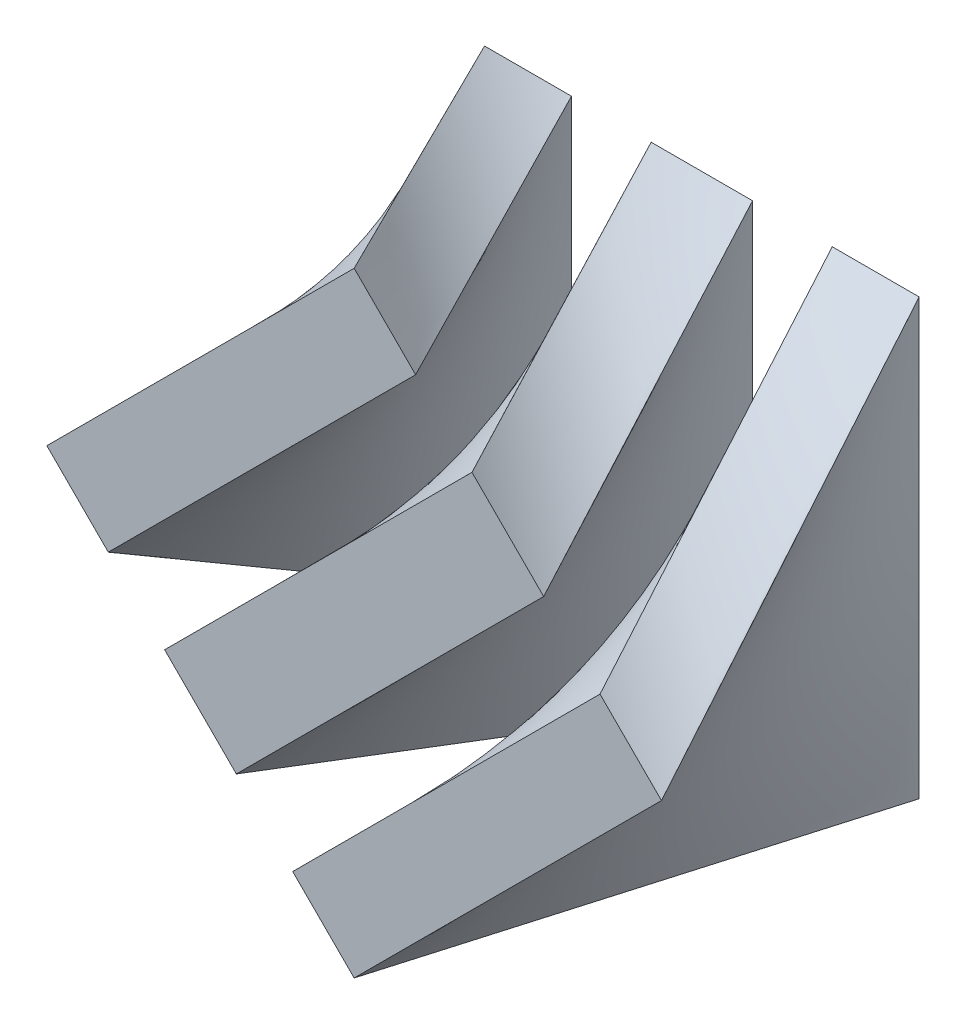
ISO-10303-21;
HEADER;
FILE_DESCRIPTION(('STEP AP214'),'2;1');
FILE_NAME('part.step','',(''),(''),'','','');
FILE_SCHEMA(('AUTOMOTIVE_DESIGN { 1 0 10303 214 1 1 1 1 }'));
ENDSEC;
DATA;
#1=APPLICATION_CONTEXT('core data for automotive mechanical design processes');
#2=APPLICATION_PROTOCOL_DEFINITION('international standard','automotive_design',2000,#1);
#3=PRODUCT_CONTEXT('',#1,'mechanical');
#4=PRODUCT('Part','Part','',(#3));
#5=PRODUCT_RELATED_PRODUCT_CATEGORY('part','',(#4));
#6=PRODUCT_DEFINITION_FORMATION('','',#4);
#7=PRODUCT_DEFINITION_CONTEXT('part definition',#1,'design');
#8=PRODUCT_DEFINITION('design','',#6,#7);
#9=PRODUCT_DEFINITION_SHAPE('','',#8);
#10=(LENGTH_UNIT() NAMED_UNIT(*) SI_UNIT(.MILLI.,.METRE.));
#11=(NAMED_UNIT(*) PLANE_ANGLE_UNIT() SI_UNIT($,.RADIAN.));
#12=(NAMED_UNIT(*) SI_UNIT($,.STERADIAN.) SOLID_ANGLE_UNIT());
#13=UNCERTAINTY_MEASURE_WITH_UNIT(LENGTH_MEASURE(1.E-05),#10,'distance_accuracy_value','');
#14=(GEOMETRIC_REPRESENTATION_CONTEXT(3) GLOBAL_UNCERTAINTY_ASSIGNED_CONTEXT((#13)) GLOBAL_UNIT_ASSIGNED_CONTEXT((#10,
#11,#12)) REPRESENTATION_CONTEXT('',''));
#15=CARTESIAN_POINT('',(0.,0.,0.));
#16=DIRECTION('',(0.,0.,1.));
#17=DIRECTION('',(1.,0.,0.));
#18=AXIS2_PLACEMENT_3D('',#15,#16,#17);
#19=CARTESIAN_POINT('',(0.,0.,0.));
#20=DIRECTION('',(0.,0.,-1.));
#21=DIRECTION('',(-1.,0.,0.));
#22=AXIS2_PLACEMENT_3D('',#19,#20,#21);
#23=PLANE('',#22);
#24=DIRECTION('',(0.,-1.,0.));
#25=VECTOR('',#24,1.);
#26=CARTESIAN_POINT('',(12.,-7.5,0.));
#27=LINE('',#26,#25);
#28=CARTESIAN_POINT('',(12.,7.5,0.));
#29=VERTEX_POINT('',#28);
#30=CARTESIAN_POINT('',(12.,-7.5,0.));
#31=VERTEX_POINT('',#30);
#32=EDGE_CURVE('E140',#29,#31,#27,.T.);
#33=ORIENTED_EDGE('',*,*,#32,.F.);
#34=DIRECTION('',(-1.,0.,0.));
#35=VECTOR('',#34,1.);
#36=CARTESIAN_POINT('',(12.,7.5,0.));
#37=LINE('',#36,#35);
#38=CARTESIAN_POINT('',(15.,7.5,0.));
#39=VERTEX_POINT('',#38);
#40=EDGE_CURVE('E196',#39,#29,#37,.T.);
#41=ORIENTED_EDGE('',*,*,#40,.F.);
#42=DIRECTION('',(0.,1.,0.));
#43=VECTOR('',#42,1.);
#44=CARTESIAN_POINT('',(15.,-7.5,0.));
#45=LINE('',#44,#43);
#46=CARTESIAN_POINT('',(15.,-7.5,0.));
#47=VERTEX_POINT('',#46);
#48=EDGE_CURVE('E80',#47,#39,#45,.T.);
#49=ORIENTED_EDGE('',*,*,#48,.F.);
#50=DIRECTION('',(1.,0.,0.));
#51=VECTOR('',#50,1.);
#52=CARTESIAN_POINT('',(12.,-7.5,0.));
#53=LINE('',#52,#51);
#54=EDGE_CURVE('E13',#31,#47,#53,.T.);
#55=ORIENTED_EDGE('',*,*,#54,.F.);
#56=EDGE_LOOP('',(#33,#41,#49,#55));
#57=FACE_BOUND('',#56,.T.);
#58=ADVANCED_FACE('F70',(#57),#23,.T.);
#59=CARTESIAN_POINT('',(0.,0.,12.));
#60=DIRECTION('',(0.,0.,-1.));
#61=DIRECTION('',(-1.,0.,0.));
#62=AXIS2_PLACEMENT_3D('',#59,#60,#61);
#63=PLANE('',#62);
#64=DIRECTION('',(0.707106781186548,-0.707106781186547,0.));
#65=VECTOR('',#64,1.);
#66=CARTESIAN_POINT('',(7.50000000000001,-10.6066017177982,12.));
#67=LINE('',#66,#65);
#68=CARTESIAN_POINT('',(5.37867965644036,-8.48528137423857,12.));
#69=VERTEX_POINT('',#68);
#70=CARTESIAN_POINT('',(7.50000000000001,-10.6066017177982,12.));
#71=VERTEX_POINT('',#70);
#72=EDGE_CURVE('E118',#69,#71,#67,.T.);
#73=ORIENTED_EDGE('',*,*,#72,.T.);
#74=DIRECTION('',(0.707106781186547,0.707106781186548,0.));
#75=VECTOR('',#74,1.);
#76=CARTESIAN_POINT('',(18.1066017177982,0.,12.));
#77=LINE('',#76,#75);
#78=CARTESIAN_POINT('',(18.1066017177982,0.,12.));
#79=VERTEX_POINT('',#78);
#80=EDGE_CURVE('E146',#71,#79,#77,.T.);
#81=ORIENTED_EDGE('',*,*,#80,.T.);
#82=DIRECTION('',(-0.707106781186548,0.707106781186547,0.));
#83=VECTOR('',#82,1.);
#84=CARTESIAN_POINT('',(15.9852813742386,2.12132034355965,12.));
#85=LINE('',#84,#83);
#86=CARTESIAN_POINT('',(15.9852813742386,2.12132034355965,12.));
#87=VERTEX_POINT('',#86);
#88=EDGE_CURVE('E121',#79,#87,#85,.T.);
#89=ORIENTED_EDGE('',*,*,#88,.T.);
#90=DIRECTION('',(-0.707106781186547,-0.707106781186548,0.));
#91=VECTOR('',#90,1.);
#92=CARTESIAN_POINT('',(5.37867965644036,-8.48528137423857,12.));
#93=LINE('',#92,#91);
#94=EDGE_CURVE('E114',#87,#69,#93,.T.);
#95=ORIENTED_EDGE('',*,*,#94,.T.);
#96=EDGE_LOOP('',(#73,#81,#89,#95));
#97=FACE_BOUND('',#96,.T.);
#98=ADVANCED_FACE('F117',(#97),#63,.F.);
#99=CARTESIAN_POINT('',(7.50000000000001,-10.6066017177982,12.));
#100=CARTESIAN_POINT('',(15.,-7.5,0.));
#101=CARTESIAN_POINT('',(7.14644660940673,-10.2530483272049,12.));
#102=CARTESIAN_POINT('',(14.5000000000001,-7.5,0.));
#103=CARTESIAN_POINT('',(6.79289321881345,-9.89949493661165,12.));
#104=CARTESIAN_POINT('',(14.0000000000002,-7.5,0.));
#105=CARTESIAN_POINT('',(6.0857864376269,-9.19238815542511,12.));
#106=CARTESIAN_POINT('',(13.0000000000002,-7.5,0.));
#107=CARTESIAN_POINT('',(5.73223304703363,-8.83883476483184,12.));
#108=CARTESIAN_POINT('',(12.5000000000001,-7.5,0.));
#109=CARTESIAN_POINT('',(5.37867965644036,-8.48528137423857,12.));
#110=CARTESIAN_POINT('',(12.,-7.5,0.));
#111=B_SPLINE_SURFACE_WITH_KNOTS('',3,1,((#99,#100),(#101,#102),(#103,#104),(#105,#106),(#107,
#108),(#109,#110)),.UNSPECIFIED.,.F.,.F.,.F.,(4,2,4),(2,2),(0.,0.5,1.),(0.,1.),.UNSPECIFIED.);
#112=DIRECTION('',(0.481869059749892,0.0717042198170069,-0.873304479615323));
#113=VECTOR('',#112,1.);
#114=CARTESIAN_POINT('',(8.68933982822018,-7.99264068711928,6.));
#115=LINE('',#114,#113);
#116=EDGE_CURVE('E135',#69,#31,#115,.T.);
#117=DIRECTION('',(-0.517671238164106,-0.214426447698045,0.82827398106257));
#118=VECTOR('',#117,1.);
#119=CARTESIAN_POINT('',(11.25,-9.0533008588991,6.));
#120=LINE('',#119,#118);
#121=EDGE_CURVE('E88',#47,#71,#120,.T.);
#122=ORIENTED_EDGE('',*,*,#72,.F.);
#123=ORIENTED_EDGE('',*,*,#116,.T.);
#124=ORIENTED_EDGE('',*,*,#54,.T.);
#125=ORIENTED_EDGE('',*,*,#121,.T.);
#126=EDGE_LOOP('',(#122,#123,#124,#125));
#127=FACE_BOUND('',#126,.T.);
#128=ADVANCED_FACE('F134',(#127),#111,.T.);
#129=CARTESIAN_POINT('',(5.37867965644036,-8.48528137423857,12.));
#130=CARTESIAN_POINT('',(12.,-7.5,0.));
#131=CARTESIAN_POINT('',(7.14644660940673,-6.7175144212722,12.));
#132=CARTESIAN_POINT('',(12.,-5.,0.));
#133=CARTESIAN_POINT('',(8.9142135623731,-4.94974746830583,12.));
#134=CARTESIAN_POINT('',(12.,-2.5,0.));
#135=CARTESIAN_POINT('',(12.4497474683058,-1.41421356237309,12.));
#136=CARTESIAN_POINT('',(12.,2.5,0.));
#137=CARTESIAN_POINT('',(14.2175144212722,0.353553390593279,12.));
#138=CARTESIAN_POINT('',(12.,5.,0.));
#139=CARTESIAN_POINT('',(15.9852813742386,2.12132034355964,12.));
#140=CARTESIAN_POINT('',(12.,7.5,0.));
#141=B_SPLINE_SURFACE_WITH_KNOTS('',3,1,((#129,#130),(#131,#132),(#133,#134),(#135,#136),(#137,
#138),(#139,#140)),.UNSPECIFIED.,.F.,.F.,.F.,(4,2,4),(2,2),(0.,0.5,1.),(0.,1.),.UNSPECIFIED.);
#142=DIRECTION('',(-0.290030339720837,0.391435419865431,-0.873304479615323));
#143=VECTOR('',#142,1.);
#144=CARTESIAN_POINT('',(13.9926406871193,4.81066017177982,6.));
#145=LINE('',#144,#143);
#146=EDGE_CURVE('E142',#87,#29,#145,.T.);
#147=ORIENTED_EDGE('',*,*,#94,.F.);
#148=ORIENTED_EDGE('',*,*,#146,.T.);
#149=ORIENTED_EDGE('',*,*,#32,.T.);
#150=ORIENTED_EDGE('',*,*,#116,.F.);
#151=EDGE_LOOP('',(#147,#148,#149,#150));
#152=FACE_BOUND('',#151,.T.);
#153=ADVANCED_FACE('F139',(#152),#141,.T.);
#154=CARTESIAN_POINT('',(18.1066017177982,0.,12.));
#155=CARTESIAN_POINT('',(15.,7.5,0.));
#156=CARTESIAN_POINT('',(16.3388347648318,-1.76776695296636,12.));
#157=CARTESIAN_POINT('',(15.,5.,0.));
#158=CARTESIAN_POINT('',(14.5710678118655,-3.53553390593273,12.));
#159=CARTESIAN_POINT('',(15.,2.50000000000001,0.));
#160=CARTESIAN_POINT('',(11.0355339059327,-7.07106781186547,12.));
#161=CARTESIAN_POINT('',(15.,-2.49999999999999,0.));
#162=CARTESIAN_POINT('',(9.26776695296637,-8.83883476483184,12.));
#163=CARTESIAN_POINT('',(15.,-5.,0.));
#164=CARTESIAN_POINT('',(7.50000000000001,-10.6066017177982,12.));
#165=CARTESIAN_POINT('',(15.,-7.5,0.));
#166=B_SPLINE_SURFACE_WITH_KNOTS('',3,1,((#154,#155),(#156,#157),(#158,#159),(#160,#161),(#162,
#163),(#164,#165)),.UNSPECIFIED.,.F.,.F.,.F.,(4,2,4),(2,2),(0.,0.5,1.),(0.,1.),.UNSPECIFIED.);
#167=DIRECTION('',(-0.214426447698045,0.517671238164106,-0.82827398106257));
#168=VECTOR('',#167,1.);
#169=CARTESIAN_POINT('',(16.5533008588991,3.75,6.));
#170=LINE('',#169,#168);
#171=EDGE_CURVE('E144',#79,#39,#170,.T.);
#172=ORIENTED_EDGE('',*,*,#80,.F.);
#173=ORIENTED_EDGE('',*,*,#121,.F.);
#174=ORIENTED_EDGE('',*,*,#48,.T.);
#175=ORIENTED_EDGE('',*,*,#171,.F.);
#176=EDGE_LOOP('',(#172,#173,#174,#175));
#177=FACE_BOUND('',#176,.T.);
#178=ADVANCED_FACE('F168',(#177),#166,.T.);
#179=CARTESIAN_POINT('',(15.9852813742386,2.12132034355965,12.));
#180=CARTESIAN_POINT('',(12.,7.5,0.));
#181=CARTESIAN_POINT('',(16.3388347648318,1.76776695296638,12.));
#182=CARTESIAN_POINT('',(12.5,7.5,0.));
#183=CARTESIAN_POINT('',(16.6923881554251,1.41421356237311,12.));
#184=CARTESIAN_POINT('',(13.,7.5,0.));
#185=CARTESIAN_POINT('',(17.3994949366116,0.707106781186561,12.));
#186=CARTESIAN_POINT('',(14.,7.5,0.));
#187=CARTESIAN_POINT('',(17.7530483272049,0.353553390593285,12.));
#188=CARTESIAN_POINT('',(14.5,7.5,0.));
#189=CARTESIAN_POINT('',(18.1066017177982,0.,12.));
#190=CARTESIAN_POINT('',(15.,7.5,0.));
#191=B_SPLINE_SURFACE_WITH_KNOTS('',3,1,((#179,#180),(#181,#182),(#183,#184),(#185,#186),(#187,
#188),(#189,#190)),.UNSPECIFIED.,.F.,.F.,.F.,(4,2,4),(2,2),(0.,0.5,1.),(0.,1.),.UNSPECIFIED.);
#192=ORIENTED_EDGE('',*,*,#88,.F.);
#193=ORIENTED_EDGE('',*,*,#171,.T.);
#194=ORIENTED_EDGE('',*,*,#40,.T.);
#195=ORIENTED_EDGE('',*,*,#146,.F.);
#196=EDGE_LOOP('',(#192,#193,#194,#195));
#197=FACE_BOUND('',#196,.T.);
#198=ADVANCED_FACE('F201',(#197),#191,.T.);
#199=CLOSED_SHELL('',(#58,#98,#128,#153,#178,#198));
#200=MANIFOLD_SOLID_BREP('B2',#199);
#201=CARTESIAN_POINT('',(0.,0.,0.));
#202=DIRECTION('',(0.,0.,-1.));
#203=DIRECTION('',(-1.,0.,0.));
#204=AXIS2_PLACEMENT_3D('',#201,#202,#203);
#205=PLANE('',#204);
#206=DIRECTION('',(0.,-1.,0.));
#207=VECTOR('',#206,1.);
#208=CARTESIAN_POINT('',(5.75000000000001,-7.5,0.));
#209=LINE('',#208,#207);
#210=CARTESIAN_POINT('',(5.74999999999999,7.5,0.));
#211=VERTEX_POINT('',#210);
#212=CARTESIAN_POINT('',(5.75000000000001,-7.5,0.));
#213=VERTEX_POINT('',#212);
#214=EDGE_CURVE('E485',#211,#213,#209,.T.);
#215=ORIENTED_EDGE('',*,*,#214,.F.);
#216=DIRECTION('',(-1.,0.,0.));
#217=VECTOR('',#216,1.);
#218=CARTESIAN_POINT('',(5.74999999999999,7.5,0.));
#219=LINE('',#218,#217);
#220=CARTESIAN_POINT('',(9.25,7.5,0.));
#221=VERTEX_POINT('',#220);
#222=EDGE_CURVE('E541',#221,#211,#219,.T.);
#223=ORIENTED_EDGE('',*,*,#222,.F.);
#224=DIRECTION('',(0.,1.,0.));
#225=VECTOR('',#224,1.);
#226=CARTESIAN_POINT('',(9.24999999999999,-7.5,0.));
#227=LINE('',#226,#225);
#228=CARTESIAN_POINT('',(9.24999999999999,-7.5,0.));
#229=VERTEX_POINT('',#228);
#230=EDGE_CURVE('E425',#229,#221,#227,.T.);
#231=ORIENTED_EDGE('',*,*,#230,.F.);
#232=DIRECTION('',(1.,0.,0.));
#233=VECTOR('',#232,1.);
#234=CARTESIAN_POINT('',(5.75000000000001,-7.5,0.));
#235=LINE('',#234,#233);
#236=EDGE_CURVE('E68',#213,#229,#235,.T.);
#237=ORIENTED_EDGE('',*,*,#236,.F.);
#238=EDGE_LOOP('',(#215,#223,#231,#237));
#239=FACE_BOUND('',#238,.T.);
#240=ADVANCED_FACE('F415',(#239),#205,.T.);
#241=CARTESIAN_POINT('',(0.,0.,12.));
#242=DIRECTION('',(0.,0.,-1.));
#243=DIRECTION('',(-1.,0.,0.));
#244=AXIS2_PLACEMENT_3D('',#241,#242,#243);
#245=PLANE('',#244);
#246=DIRECTION('',(0.707106781186547,-0.707106781186548,0.));
#247=VECTOR('',#246,1.);
#248=CARTESIAN_POINT('',(3.43413600817734,-6.54073772597555,12.));
#249=LINE('',#248,#247);
#250=CARTESIAN_POINT('',(0.959262274024423,-4.06586399182263,12.));
#251=VERTEX_POINT('',#250);
#252=CARTESIAN_POINT('',(3.43413600817734,-6.54073772597555,12.));
#253=VERTEX_POINT('',#252);
#254=EDGE_CURVE('E463',#251,#253,#249,.T.);
#255=ORIENTED_EDGE('',*,*,#254,.T.);
#256=DIRECTION('',(0.707106781186549,0.707106781186546,0.));
#257=VECTOR('',#256,1.);
#258=CARTESIAN_POINT('',(14.0407377259756,4.06586399182264,12.));
#259=LINE('',#258,#257);
#260=CARTESIAN_POINT('',(14.0407377259756,4.06586399182264,12.));
#261=VERTEX_POINT('',#260);
#262=EDGE_CURVE('E491',#253,#261,#259,.T.);
#263=ORIENTED_EDGE('',*,*,#262,.T.);
#264=DIRECTION('',(-0.707106781186546,0.707106781186549,0.));
#265=VECTOR('',#264,1.);
#266=CARTESIAN_POINT('',(11.5658639918226,6.54073772597556,12.));
#267=LINE('',#266,#265);
#268=CARTESIAN_POINT('',(11.5658639918226,6.54073772597556,12.));
#269=VERTEX_POINT('',#268);
#270=EDGE_CURVE('E466',#261,#269,#267,.T.);
#271=ORIENTED_EDGE('',*,*,#270,.T.);
#272=DIRECTION('',(-0.707106781186549,-0.707106781186546,0.));
#273=VECTOR('',#272,1.);
#274=CARTESIAN_POINT('',(0.959262274024423,-4.06586399182263,12.));
#275=LINE('',#274,#273);
#276=EDGE_CURVE('E459',#269,#251,#275,.T.);
#277=ORIENTED_EDGE('',*,*,#276,.T.);
#278=EDGE_LOOP('',(#255,#263,#271,#277));
#279=FACE_BOUND('',#278,.T.);
#280=ADVANCED_FACE('F462',(#279),#245,.F.);
#281=CARTESIAN_POINT('',(3.43413600817734,-6.54073772597555,12.));
#282=CARTESIAN_POINT('',(9.24999999999999,-7.5,0.));
#283=CARTESIAN_POINT('',(3.02165705248518,-6.12825877028339,12.));
#284=CARTESIAN_POINT('',(8.66666666666665,-7.5,0.));
#285=CARTESIAN_POINT('',(2.60917809679303,-5.71577981459124,12.));
#286=CARTESIAN_POINT('',(8.08333333333332,-7.5,0.));
#287=CARTESIAN_POINT('',(1.78422018540872,-4.89082190320693,12.));
#288=CARTESIAN_POINT('',(6.91666666666666,-7.5,0.));
#289=CARTESIAN_POINT('',(1.37174122971657,-4.47834294751478,12.));
#290=CARTESIAN_POINT('',(6.33333333333333,-7.5,0.));
#291=CARTESIAN_POINT('',(0.959262274024423,-4.06586399182263,12.));
#292=CARTESIAN_POINT('',(5.75000000000001,-7.5,0.));
#293=B_SPLINE_SURFACE_WITH_KNOTS('',3,1,((#281,#282),(#283,#284),(#285,#286),(#287,#288),(#289,
#290),(#291,#292)),.UNSPECIFIED.,.F.,.F.,.F.,(4,2,4),(2,2),(0.,0.5,1.),(0.,1.),.UNSPECIFIED.);
#294=DIRECTION('',(0.358332420211046,-0.256862791814283,-0.897563024420607));
#295=VECTOR('',#294,1.);
#296=CARTESIAN_POINT('',(3.35463113701222,-5.78293199591131,6.));
#297=LINE('',#296,#295);
#298=EDGE_CURVE('E480',#251,#213,#297,.T.);
#299=DIRECTION('',(-0.435008706176604,0.0717498623238315,0.897563024420608));
#300=VECTOR('',#299,1.);
#301=CARTESIAN_POINT('',(6.34206800408866,-7.02036886298777,6.));
#302=LINE('',#301,#300);
#303=EDGE_CURVE('E433',#229,#253,#302,.T.);
#304=ORIENTED_EDGE('',*,*,#254,.F.);
#305=ORIENTED_EDGE('',*,*,#298,.T.);
#306=ORIENTED_EDGE('',*,*,#236,.T.);
#307=ORIENTED_EDGE('',*,*,#303,.T.);
#308=EDGE_LOOP('',(#304,#305,#306,#307));
#309=FACE_BOUND('',#308,.T.);
#310=ADVANCED_FACE('F479',(#309),#293,.T.);
#311=CARTESIAN_POINT('',(0.959262274024423,-4.06586399182263,12.));
#312=CARTESIAN_POINT('',(5.75000000000001,-7.5,0.));
#313=CARTESIAN_POINT('',(2.7270292269908,-2.29809703885626,12.));
#314=CARTESIAN_POINT('',(5.75000000000001,-5.,0.));
#315=CARTESIAN_POINT('',(4.49479617995717,-0.530330085889892,12.));
#316=CARTESIAN_POINT('',(5.75,-2.5,0.));
#317=CARTESIAN_POINT('',(8.03033008588991,3.00520382004284,12.));
#318=CARTESIAN_POINT('',(5.75,2.5,0.));
#319=CARTESIAN_POINT('',(9.79809703885628,4.7729707730092,12.));
#320=CARTESIAN_POINT('',(5.75,5.,0.));
#321=CARTESIAN_POINT('',(11.5658639918226,6.54073772597556,12.));
#322=CARTESIAN_POINT('',(5.74999999999999,7.5,0.));
#323=B_SPLINE_SURFACE_WITH_KNOTS('',3,1,((#311,#312),(#313,#314),(#315,#316),(#317,#318),(#319,
#320),(#321,#322)),.UNSPECIFIED.,.F.,.F.,.F.,(4,2,4),(2,2),(0.,0.5,1.),(0.,1.),.UNSPECIFIED.);
#324=DIRECTION('',(-0.435008706176604,0.0717498623238302,-0.897563024420608));
#325=VECTOR('',#324,1.);
#326=CARTESIAN_POINT('',(8.65793199591132,7.02036886298778,6.));
#327=LINE('',#326,#325);
#328=EDGE_CURVE('E487',#269,#211,#327,.T.);
#329=ORIENTED_EDGE('',*,*,#276,.F.);
#330=ORIENTED_EDGE('',*,*,#328,.T.);
#331=ORIENTED_EDGE('',*,*,#214,.T.);
#332=ORIENTED_EDGE('',*,*,#298,.F.);
#333=EDGE_LOOP('',(#329,#330,#331,#332));
#334=FACE_BOUND('',#333,.T.);
#335=ADVANCED_FACE('F484',(#334),#323,.T.);
#336=CARTESIAN_POINT('',(14.0407377259756,4.06586399182264,12.));
#337=CARTESIAN_POINT('',(9.25,7.5,0.));
#338=CARTESIAN_POINT('',(12.2729707730092,2.29809703885628,12.));
#339=CARTESIAN_POINT('',(9.25,5.,0.));
#340=CARTESIAN_POINT('',(10.5052038200428,0.530330085889913,12.));
#341=CARTESIAN_POINT('',(9.25,2.5,0.));
#342=CARTESIAN_POINT('',(6.96966991411007,-3.00520382004282,12.));
#343=CARTESIAN_POINT('',(9.24999999999999,-2.5,0.));
#344=CARTESIAN_POINT('',(5.2019029611437,-4.77297077300918,12.));
#345=CARTESIAN_POINT('',(9.24999999999999,-5.,0.));
#346=CARTESIAN_POINT('',(3.43413600817733,-6.54073772597555,12.));
#347=CARTESIAN_POINT('',(9.24999999999999,-7.5,0.));
#348=B_SPLINE_SURFACE_WITH_KNOTS('',3,1,((#336,#337),(#338,#339),(#340,#341),(#342,#343),(#344,
#345),(#346,#347)),.UNSPECIFIED.,.F.,.F.,.F.,(4,2,4),(2,2),(0.,0.5,1.),(0.,1.),.UNSPECIFIED.);
#349=DIRECTION('',(-0.358332420211044,0.256862791814282,-0.897563024420608));
#350=VECTOR('',#349,1.);
#351=CARTESIAN_POINT('',(11.6453688629878,5.78293199591132,6.));
#352=LINE('',#351,#350);
#353=EDGE_CURVE('E489',#261,#221,#352,.T.);
#354=ORIENTED_EDGE('',*,*,#262,.F.);
#355=ORIENTED_EDGE('',*,*,#303,.F.);
#356=ORIENTED_EDGE('',*,*,#230,.T.);
#357=ORIENTED_EDGE('',*,*,#353,.F.);
#358=EDGE_LOOP('',(#354,#355,#356,#357));
#359=FACE_BOUND('',#358,.T.);
#360=ADVANCED_FACE('F513',(#359),#348,.T.);
#361=CARTESIAN_POINT('',(11.5658639918226,6.54073772597556,12.));
#362=CARTESIAN_POINT('',(5.74999999999999,7.5,0.));
#363=CARTESIAN_POINT('',(11.9783429475148,6.12825877028341,12.));
#364=CARTESIAN_POINT('',(6.33333333333333,7.5,0.));
#365=CARTESIAN_POINT('',(12.3908219032069,5.71577981459126,12.));
#366=CARTESIAN_POINT('',(6.91666666666666,7.5,0.));
#367=CARTESIAN_POINT('',(13.2157798145912,4.89082190320696,12.));
#368=CARTESIAN_POINT('',(8.08333333333333,7.5,0.));
#369=CARTESIAN_POINT('',(13.6282587702834,4.4783429475148,12.));
#370=CARTESIAN_POINT('',(8.66666666666666,7.5,0.));
#371=CARTESIAN_POINT('',(14.0407377259756,4.06586399182264,12.));
#372=CARTESIAN_POINT('',(9.25,7.5,0.));
#373=B_SPLINE_SURFACE_WITH_KNOTS('',3,1,((#361,#362),(#363,#364),(#365,#366),(#367,#368),(#369,
#370),(#371,#372)),.UNSPECIFIED.,.F.,.F.,.F.,(4,2,4),(2,2),(0.,0.5,1.),(0.,1.),.UNSPECIFIED.);
#374=ORIENTED_EDGE('',*,*,#270,.F.);
#375=ORIENTED_EDGE('',*,*,#353,.T.);
#376=ORIENTED_EDGE('',*,*,#222,.T.);
#377=ORIENTED_EDGE('',*,*,#328,.F.);
#378=EDGE_LOOP('',(#374,#375,#376,#377));
#379=FACE_BOUND('',#378,.T.);
#380=ADVANCED_FACE('F546',(#379),#373,.T.);
#381=CLOSED_SHELL('',(#240,#280,#310,#335,#360,#380));
#382=MANIFOLD_SOLID_BREP('B7',#381);
#383=CARTESIAN_POINT('',(0.,0.,0.));
#384=DIRECTION('',(0.,0.,-1.));
#385=DIRECTION('',(-1.,0.,0.));
#386=AXIS2_PLACEMENT_3D('',#383,#384,#385);
#387=PLANE('',#386);
#388=DIRECTION('',(0.,-1.,0.));
#389=VECTOR('',#388,1.);
#390=CARTESIAN_POINT('',(0.,-7.5,0.));
#391=LINE('',#390,#389);
#392=CARTESIAN_POINT('',(0.,7.5,0.));
#393=VERTEX_POINT('',#392);
#394=CARTESIAN_POINT('',(0.,-7.5,0.));
#395=VERTEX_POINT('',#394);
#396=EDGE_CURVE('E821',#393,#395,#391,.T.);
#397=ORIENTED_EDGE('',*,*,#396,.F.);
#398=DIRECTION('',(-1.,0.,0.));
#399=VECTOR('',#398,1.);
#400=CARTESIAN_POINT('',(0.,7.5,0.));
#401=LINE('',#400,#399);
#402=CARTESIAN_POINT('',(3.,7.5,0.));
#403=VERTEX_POINT('',#402);
#404=EDGE_CURVE('E875',#403,#393,#401,.T.);
#405=ORIENTED_EDGE('',*,*,#404,.F.);
#406=DIRECTION('',(0.,1.,0.));
#407=VECTOR('',#406,1.);
#408=CARTESIAN_POINT('',(3.,-7.5,0.));
#409=LINE('',#408,#407);
#410=CARTESIAN_POINT('',(3.,-7.5,0.));
#411=VERTEX_POINT('',#410);
#412=EDGE_CURVE('E761',#411,#403,#409,.T.);
#413=ORIENTED_EDGE('',*,*,#412,.F.);
#414=DIRECTION('',(1.,0.,0.));
#415=VECTOR('',#414,1.);
#416=CARTESIAN_POINT('',(0.,-7.5,0.));
#417=LINE('',#416,#415);
#418=EDGE_CURVE('E413',#395,#411,#417,.T.);
#419=ORIENTED_EDGE('',*,*,#418,.F.);
#420=EDGE_LOOP('',(#397,#405,#413,#419));
#421=FACE_BOUND('',#420,.T.);
#422=ADVANCED_FACE('F751',(#421),#387,.T.);
#423=CARTESIAN_POINT('',(0.,0.,12.));
#424=DIRECTION('',(0.,0.,-1.));
#425=DIRECTION('',(-1.,0.,0.));
#426=AXIS2_PLACEMENT_3D('',#423,#424,#425);
#427=PLANE('',#426);
#428=DIRECTION('',(0.707106781186547,-0.707106781186548,0.));
#429=VECTOR('',#428,1.);
#430=CARTESIAN_POINT('',(-0.98528137423857,-2.12132034355963,12.));
#431=LINE('',#430,#429);
#432=CARTESIAN_POINT('',(-3.10660171779821,0.,12.));
#433=VERTEX_POINT('',#432);
#434=CARTESIAN_POINT('',(-0.98528137423857,-2.12132034355963,12.));
#435=VERTEX_POINT('',#434);
#436=EDGE_CURVE('E799',#433,#435,#431,.T.);
#437=ORIENTED_EDGE('',*,*,#436,.T.);
#438=DIRECTION('',(0.707106781186549,0.707106781186546,0.));
#439=VECTOR('',#438,1.);
#440=CARTESIAN_POINT('',(9.62132034355966,8.48528137423857,12.));
#441=LINE('',#440,#439);
#442=CARTESIAN_POINT('',(9.62132034355966,8.48528137423857,12.));
#443=VERTEX_POINT('',#442);
#444=EDGE_CURVE('E824',#435,#443,#441,.T.);
#445=ORIENTED_EDGE('',*,*,#444,.T.);
#446=DIRECTION('',(-0.707106781186547,0.707106781186548,0.));
#447=VECTOR('',#446,1.);
#448=CARTESIAN_POINT('',(7.50000000000002,10.6066017177982,12.));
#449=LINE('',#448,#447);
#450=CARTESIAN_POINT('',(7.50000000000002,10.6066017177982,12.));
#451=VERTEX_POINT('',#450);
#452=EDGE_CURVE('E802',#443,#451,#449,.T.);
#453=ORIENTED_EDGE('',*,*,#452,.T.);
#454=DIRECTION('',(-0.707106781186549,-0.707106781186546,0.));
#455=VECTOR('',#454,1.);
#456=CARTESIAN_POINT('',(-3.10660171779821,0.,12.));
#457=LINE('',#456,#455);
#458=EDGE_CURVE('E795',#451,#433,#457,.T.);
#459=ORIENTED_EDGE('',*,*,#458,.T.);
#460=EDGE_LOOP('',(#437,#445,#453,#459));
#461=FACE_BOUND('',#460,.T.);
#462=ADVANCED_FACE('F798',(#461),#427,.F.);
#463=CARTESIAN_POINT('',(-3.10660171779821,0.,12.));
#464=CARTESIAN_POINT('',(0.,-7.5,0.));
#465=CARTESIAN_POINT('',(-1.33883476483184,1.76776695296638,12.));
#466=CARTESIAN_POINT('',(0.,-5.,0.));
#467=CARTESIAN_POINT('',(0.428932188134526,3.53553390593274,12.));
#468=CARTESIAN_POINT('',(0.,-2.5,0.));
#469=CARTESIAN_POINT('',(3.96446609406727,7.07106781186547,12.));
#470=CARTESIAN_POINT('',(0.,2.5,0.));
#471=CARTESIAN_POINT('',(5.73223304703364,8.83883476483184,12.));
#472=CARTESIAN_POINT('',(0.,5.,0.));
#473=CARTESIAN_POINT('',(7.50000000000002,10.6066017177982,12.));
#474=CARTESIAN_POINT('',(0.,7.5,0.));
#475=B_SPLINE_SURFACE_WITH_KNOTS('',3,1,((#463,#464),(#465,#466),(#467,#468),(#469,#470),(#471,
#472),(#473,#474)),.UNSPECIFIED.,.F.,.F.,.F.,(4,2,4),(2,2),(0.,0.5,1.),(0.,1.),.UNSPECIFIED.);
#476=DIRECTION('',(-0.517671238164107,-0.214426447698045,-0.82827398106257));
#477=VECTOR('',#476,1.);
#478=CARTESIAN_POINT('',(3.75000000000001,9.0533008588991,6.));
#479=LINE('',#478,#477);
#480=EDGE_CURVE('E823',#451,#393,#479,.T.);
#481=DIRECTION('',(-0.214426447698045,0.517671238164107,0.82827398106257));
#482=VECTOR('',#481,1.);
#483=CARTESIAN_POINT('',(-1.55330085889911,-3.74999999999999,6.));
#484=LINE('',#483,#482);
#485=EDGE_CURVE('E816',#395,#433,#484,.T.);
#486=ORIENTED_EDGE('',*,*,#458,.F.);
#487=ORIENTED_EDGE('',*,*,#480,.T.);
#488=ORIENTED_EDGE('',*,*,#396,.T.);
#489=ORIENTED_EDGE('',*,*,#485,.T.);
#490=EDGE_LOOP('',(#486,#487,#488,#489));
#491=FACE_BOUND('',#490,.T.);
#492=ADVANCED_FACE('F820',(#491),#475,.T.);
#493=CARTESIAN_POINT('',(7.50000000000002,10.6066017177982,12.));
#494=CARTESIAN_POINT('',(0.,7.5,0.));
#495=CARTESIAN_POINT('',(7.85355339059329,10.2530483272049,12.));
#496=CARTESIAN_POINT('',(0.5,7.5,0.));
#497=CARTESIAN_POINT('',(8.20710678118657,9.89949493661166,12.));
#498=CARTESIAN_POINT('',(1.,7.5,0.));
#499=CARTESIAN_POINT('',(8.91421356237311,9.19238815542511,12.));
#500=CARTESIAN_POINT('',(2.,7.5,0.));
#501=CARTESIAN_POINT('',(9.26776695296639,8.83883476483184,12.));
#502=CARTESIAN_POINT('',(2.5,7.5,0.));
#503=CARTESIAN_POINT('',(9.62132034355966,8.48528137423857,12.));
#504=CARTESIAN_POINT('',(3.,7.5,0.));
#505=B_SPLINE_SURFACE_WITH_KNOTS('',3,1,((#493,#494),(#495,#496),(#497,#498),(#499,#500),(#501,
#502),(#503,#504)),.UNSPECIFIED.,.F.,.F.,.F.,(4,2,4),(2,2),(0.,0.5,1.),(0.,1.),.UNSPECIFIED.);
#506=DIRECTION('',(-0.481869059749893,-0.0717042198170067,-0.873304479615322));
#507=VECTOR('',#506,1.);
#508=CARTESIAN_POINT('',(6.31066017177983,7.99264068711928,6.));
#509=LINE('',#508,#507);
#510=EDGE_CURVE('E826',#443,#403,#509,.T.);
#511=ORIENTED_EDGE('',*,*,#452,.F.);
#512=ORIENTED_EDGE('',*,*,#510,.T.);
#513=ORIENTED_EDGE('',*,*,#404,.T.);
#514=ORIENTED_EDGE('',*,*,#480,.F.);
#515=EDGE_LOOP('',(#511,#512,#513,#514));
#516=FACE_BOUND('',#515,.T.);
#517=ADVANCED_FACE('F850',(#516),#505,.T.);
#518=CARTESIAN_POINT('',(-0.98528137423857,-2.12132034355963,12.));
#519=CARTESIAN_POINT('',(3.,-7.5,0.));
#520=CARTESIAN_POINT('',(-1.33883476483185,-1.76776695296635,12.));
#521=CARTESIAN_POINT('',(2.5,-7.5,0.));
#522=CARTESIAN_POINT('',(-1.69238815542512,-1.41421356237308,12.));
#523=CARTESIAN_POINT('',(2.,-7.5,0.));
#524=CARTESIAN_POINT('',(-2.39949493661167,-0.707106781186527,12.));
#525=CARTESIAN_POINT('',(1.,-7.5,0.));
#526=CARTESIAN_POINT('',(-2.75304832720494,-0.353553390593253,12.));
#527=CARTESIAN_POINT('',(0.5,-7.5,0.));
#528=CARTESIAN_POINT('',(-3.10660171779821,0.,12.));
#529=CARTESIAN_POINT('',(0.,-7.5,0.));
#530=B_SPLINE_SURFACE_WITH_KNOTS('',3,1,((#518,#519),(#520,#521),(#522,#523),(#524,#525),(#526,
#527),(#528,#529)),.UNSPECIFIED.,.F.,.F.,.F.,(4,2,4),(2,2),(0.,0.5,1.),(0.,1.),.UNSPECIFIED.);
#531=DIRECTION('',(0.290030339720837,-0.391435419865432,-0.873304479615322));
#532=VECTOR('',#531,1.);
#533=CARTESIAN_POINT('',(1.00735931288072,-4.81066017177981,6.));
#534=LINE('',#533,#532);
#535=EDGE_CURVE('E769',#435,#411,#534,.T.);
#536=ORIENTED_EDGE('',*,*,#436,.F.);
#537=ORIENTED_EDGE('',*,*,#485,.F.);
#538=ORIENTED_EDGE('',*,*,#418,.T.);
#539=ORIENTED_EDGE('',*,*,#535,.F.);
#540=EDGE_LOOP('',(#536,#537,#538,#539));
#541=FACE_BOUND('',#540,.T.);
#542=ADVANCED_FACE('F815',(#541),#530,.T.);
#543=CARTESIAN_POINT('',(9.62132034355966,8.48528137423857,12.));
#544=CARTESIAN_POINT('',(3.,7.5,0.));
#545=CARTESIAN_POINT('',(7.85355339059329,6.7175144212722,12.));
#546=CARTESIAN_POINT('',(3.,5.00000000000001,0.));
#547=CARTESIAN_POINT('',(6.08578643762692,4.94974746830584,12.));
#548=CARTESIAN_POINT('',(3.,2.50000000000002,0.));
#549=CARTESIAN_POINT('',(2.55025253169418,1.41421356237311,12.));
#550=CARTESIAN_POINT('',(3.,-2.49999999999998,0.));
#551=CARTESIAN_POINT('',(0.782485578727807,-0.353553390593255,12.));
#552=CARTESIAN_POINT('',(3.,-4.99999999999999,0.));
#553=CARTESIAN_POINT('',(-0.985281374238568,-2.12132034355962,12.));
#554=CARTESIAN_POINT('',(3.,-7.5,0.));
#555=B_SPLINE_SURFACE_WITH_KNOTS('',3,1,((#543,#544),(#545,#546),(#547,#548),(#549,#550),(#551,
#552),(#553,#554)),.UNSPECIFIED.,.F.,.F.,.F.,(4,2,4),(2,2),(0.,0.5,1.),(0.,1.),.UNSPECIFIED.);
#556=ORIENTED_EDGE('',*,*,#444,.F.);
#557=ORIENTED_EDGE('',*,*,#535,.T.);
#558=ORIENTED_EDGE('',*,*,#412,.T.);
#559=ORIENTED_EDGE('',*,*,#510,.F.);
#560=EDGE_LOOP('',(#556,#557,#558,#559));
#561=FACE_BOUND('',#560,.T.);
#562=ADVANCED_FACE('F890',(#561),#555,.T.);
#563=CLOSED_SHELL('',(#422,#462,#492,#517,#542,#562));
#564=MANIFOLD_SOLID_BREP('B62',#563);
#565=ADVANCED_BREP_SHAPE_REPRESENTATION('',(#18,#200,#382,#564),#14);
#566=SHAPE_DEFINITION_REPRESENTATION(#9,#565);
ENDSEC;
END-ISO-10303-21;
